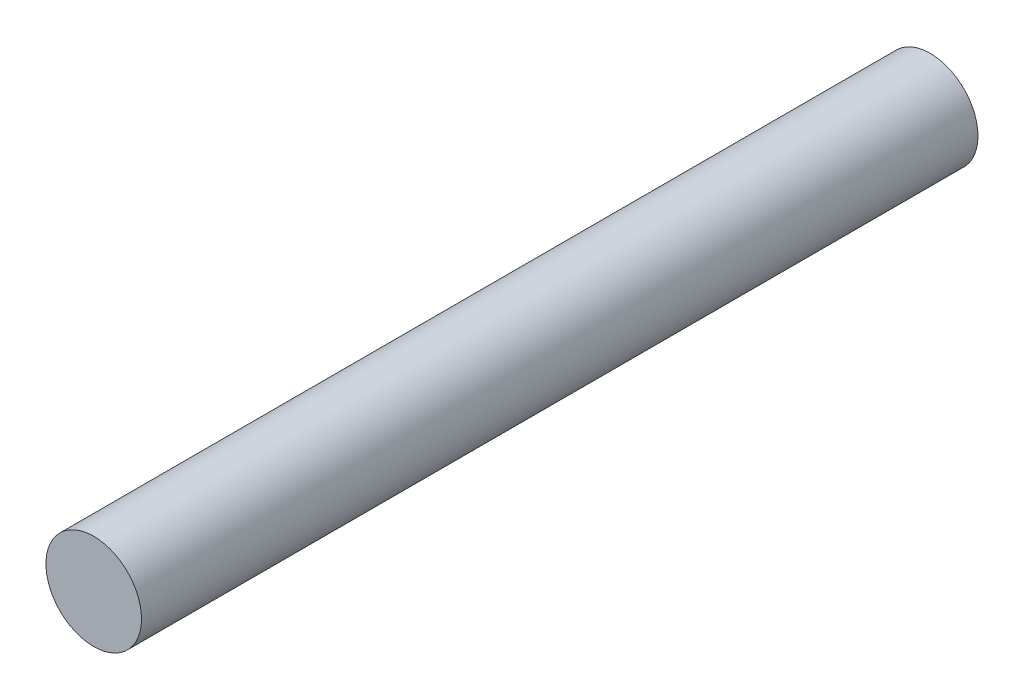
ISO-10303-21;
HEADER;
FILE_DESCRIPTION(('STEP AP214'),'2;1');
FILE_NAME('part.step','',(''),(''),'','','');
FILE_SCHEMA(('AUTOMOTIVE_DESIGN { 1 0 10303 214 1 1 1 1 }'));
ENDSEC;
DATA;
#1=APPLICATION_CONTEXT('core data for automotive mechanical design processes');
#2=APPLICATION_PROTOCOL_DEFINITION('international standard','automotive_design',2000,#1);
#3=PRODUCT_CONTEXT('',#1,'mechanical');
#4=PRODUCT('Part','Part','',(#3));
#5=PRODUCT_RELATED_PRODUCT_CATEGORY('part','',(#4));
#6=PRODUCT_DEFINITION_FORMATION('','',#4);
#7=PRODUCT_DEFINITION_CONTEXT('part definition',#1,'design');
#8=PRODUCT_DEFINITION('design','',#6,#7);
#9=PRODUCT_DEFINITION_SHAPE('','',#8);
#10=(LENGTH_UNIT() NAMED_UNIT(*) SI_UNIT(.MILLI.,.METRE.));
#11=(NAMED_UNIT(*) PLANE_ANGLE_UNIT() SI_UNIT($,.RADIAN.));
#12=(NAMED_UNIT(*) SI_UNIT($,.STERADIAN.) SOLID_ANGLE_UNIT());
#13=UNCERTAINTY_MEASURE_WITH_UNIT(LENGTH_MEASURE(1.E-05),#10,'distance_accuracy_value','');
#14=(GEOMETRIC_REPRESENTATION_CONTEXT(3) GLOBAL_UNCERTAINTY_ASSIGNED_CONTEXT((#13)) GLOBAL_UNIT_ASSIGNED_CONTEXT((#10,
#11,#12)) REPRESENTATION_CONTEXT('',''));
#15=CARTESIAN_POINT('',(0.,0.,0.));
#16=DIRECTION('',(0.,0.,1.));
#17=DIRECTION('',(1.,0.,0.));
#18=AXIS2_PLACEMENT_3D('',#15,#16,#17);
#19=CARTESIAN_POINT('',(0.,0.,7.));
#20=DIRECTION('',(0.,0.,-1.));
#21=DIRECTION('',(-1.,0.,0.));
#22=AXIS2_PLACEMENT_3D('',#19,#20,#21);
#23=CYLINDRICAL_SURFACE('',#22,0.4);
#24=CARTESIAN_POINT('',(0.,0.,7.));
#25=DIRECTION('',(0.,0.,1.));
#26=DIRECTION('',(1.,0.,0.));
#27=AXIS2_PLACEMENT_3D('',#24,#25,#26);
#28=CIRCLE('',#27,0.4);
#29=CARTESIAN_POINT('',(0.4,0.,7.));
#30=VERTEX_POINT('',#29);
#31=EDGE_CURVE('E10',#30,#30,#28,.T.);
#32=ORIENTED_EDGE('',*,*,#31,.F.);
#33=EDGE_LOOP('',(#32));
#34=FACE_BOUND('',#33,.T.);
#35=CARTESIAN_POINT('',(0.,0.,0.));
#36=DIRECTION('',(0.,0.,1.));
#37=DIRECTION('',(1.,0.,0.));
#38=AXIS2_PLACEMENT_3D('',#35,#36,#37);
#39=CIRCLE('',#38,0.4);
#40=CARTESIAN_POINT('',(0.4,0.,0.));
#41=VERTEX_POINT('',#40);
#42=EDGE_CURVE('E38',#41,#41,#39,.T.);
#43=ORIENTED_EDGE('',*,*,#42,.T.);
#44=EDGE_LOOP('',(#43));
#45=FACE_BOUND('',#44,.T.);
#46=ADVANCED_FACE('F35',(#34,#45),#23,.T.);
#47=CARTESIAN_POINT('',(0.,0.,7.));
#48=DIRECTION('',(0.,0.,1.));
#49=DIRECTION('',(1.,0.,0.));
#50=AXIS2_PLACEMENT_3D('',#47,#48,#49);
#51=PLANE('',#50);
#52=ORIENTED_EDGE('',*,*,#31,.T.);
#53=EDGE_LOOP('',(#52));
#54=FACE_BOUND('',#53,.T.);
#55=ADVANCED_FACE('F50',(#54),#51,.T.);
#56=CARTESIAN_POINT('',(0.,0.,0.));
#57=DIRECTION('',(0.,0.,1.));
#58=DIRECTION('',(1.,0.,0.));
#59=AXIS2_PLACEMENT_3D('',#56,#57,#58);
#60=PLANE('',#59);
#61=ORIENTED_EDGE('',*,*,#42,.F.);
#62=EDGE_LOOP('',(#61));
#63=FACE_BOUND('',#62,.T.);
#64=ADVANCED_FACE('F48',(#63),#60,.F.);
#65=CLOSED_SHELL('',(#46,#55,#64));
#66=MANIFOLD_SOLID_BREP('B2',#65);
#67=ADVANCED_BREP_SHAPE_REPRESENTATION('',(#18,#66),#14);
#68=SHAPE_DEFINITION_REPRESENTATION(#9,#67);
ENDSEC;
END-ISO-10303-21;
